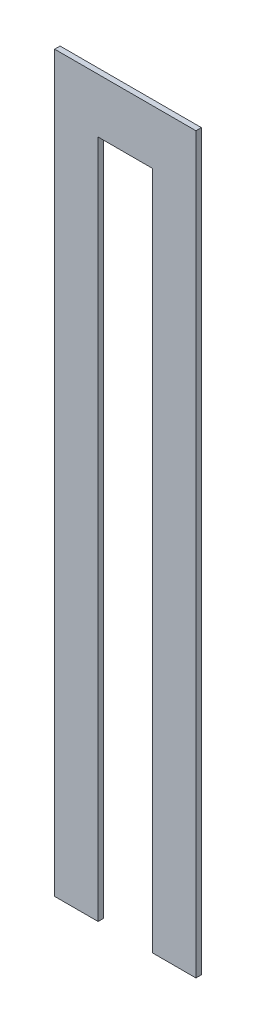
ISO-10303-21;
HEADER;
FILE_DESCRIPTION(('STEP AP214'),'2;1');
FILE_NAME('part.step','',(''),(''),'','','');
FILE_SCHEMA(('AUTOMOTIVE_DESIGN { 1 0 10303 214 1 1 1 1 }'));
ENDSEC;
DATA;
#1=APPLICATION_CONTEXT('core data for automotive mechanical design processes');
#2=APPLICATION_PROTOCOL_DEFINITION('international standard','automotive_design',2000,#1);
#3=PRODUCT_CONTEXT('',#1,'mechanical');
#4=PRODUCT('Part','Part','',(#3));
#5=PRODUCT_RELATED_PRODUCT_CATEGORY('part','',(#4));
#6=PRODUCT_DEFINITION_FORMATION('','',#4);
#7=PRODUCT_DEFINITION_CONTEXT('part definition',#1,'design');
#8=PRODUCT_DEFINITION('design','',#6,#7);
#9=PRODUCT_DEFINITION_SHAPE('','',#8);
#10=(LENGTH_UNIT() NAMED_UNIT(*) SI_UNIT(.MILLI.,.METRE.));
#11=(NAMED_UNIT(*) PLANE_ANGLE_UNIT() SI_UNIT($,.RADIAN.));
#12=(NAMED_UNIT(*) SI_UNIT($,.STERADIAN.) SOLID_ANGLE_UNIT());
#13=UNCERTAINTY_MEASURE_WITH_UNIT(LENGTH_MEASURE(1.E-05),#10,'distance_accuracy_value','');
#14=(GEOMETRIC_REPRESENTATION_CONTEXT(3) GLOBAL_UNCERTAINTY_ASSIGNED_CONTEXT((#13)) GLOBAL_UNIT_ASSIGNED_CONTEXT((#10,
#11,#12)) REPRESENTATION_CONTEXT('',''));
#15=CARTESIAN_POINT('',(0.,0.,0.));
#16=DIRECTION('',(0.,0.,1.));
#17=DIRECTION('',(1.,0.,0.));
#18=AXIS2_PLACEMENT_3D('',#15,#16,#17);
#19=CARTESIAN_POINT('',(-6.50000000000001,67.5,0.5));
#20=DIRECTION('',(1.,0.,0.));
#21=DIRECTION('',(0.,1.,0.));
#22=AXIS2_PLACEMENT_3D('',#19,#20,#21);
#23=PLANE('',#22);
#24=DIRECTION('',(0.,-1.,0.));
#25=VECTOR('',#24,1.);
#26=CARTESIAN_POINT('',(-6.50000000000001,67.5,0.));
#27=LINE('',#26,#25);
#28=CARTESIAN_POINT('',(-6.50000000000001,67.5,0.));
#29=VERTEX_POINT('',#28);
#30=CARTESIAN_POINT('',(-6.5,0.,0.));
#31=VERTEX_POINT('',#30);
#32=EDGE_CURVE('E131',#29,#31,#27,.T.);
#33=ORIENTED_EDGE('',*,*,#32,.T.);
#34=DIRECTION('',(0.,0.,-1.));
#35=VECTOR('',#34,1.);
#36=CARTESIAN_POINT('',(-6.5,0.,0.5));
#37=LINE('',#36,#35);
#38=CARTESIAN_POINT('',(-6.5,0.,0.5));
#39=VERTEX_POINT('',#38);
#40=EDGE_CURVE('E11',#39,#31,#37,.T.);
#41=ORIENTED_EDGE('',*,*,#40,.F.);
#42=DIRECTION('',(0.,-1.,0.));
#43=VECTOR('',#42,1.);
#44=CARTESIAN_POINT('',(-6.50000000000001,67.5,0.5));
#45=LINE('',#44,#43);
#46=CARTESIAN_POINT('',(-6.50000000000001,67.5,0.5));
#47=VERTEX_POINT('',#46);
#48=EDGE_CURVE('E145',#47,#39,#45,.T.);
#49=ORIENTED_EDGE('',*,*,#48,.F.);
#50=DIRECTION('',(0.,0.,-1.));
#51=VECTOR('',#50,1.);
#52=CARTESIAN_POINT('',(-6.50000000000001,67.5,0.5));
#53=LINE('',#52,#51);
#54=EDGE_CURVE('E127',#47,#29,#53,.T.);
#55=ORIENTED_EDGE('',*,*,#54,.T.);
#56=EDGE_LOOP('',(#33,#41,#49,#55));
#57=FACE_BOUND('',#56,.T.);
#58=ADVANCED_FACE('F35',(#57),#23,.F.);
#59=CARTESIAN_POINT('',(-6.5,0.,0.5));
#60=DIRECTION('',(0.,1.,0.));
#61=DIRECTION('',(0.,0.,1.));
#62=AXIS2_PLACEMENT_3D('',#59,#60,#61);
#63=PLANE('',#62);
#64=DIRECTION('',(1.,0.,0.));
#65=VECTOR('',#64,1.);
#66=CARTESIAN_POINT('',(-6.5,0.,0.));
#67=LINE('',#66,#65);
#68=CARTESIAN_POINT('',(-2.5,0.,0.));
#69=VERTEX_POINT('',#68);
#70=EDGE_CURVE('E134',#31,#69,#67,.T.);
#71=ORIENTED_EDGE('',*,*,#70,.T.);
#72=DIRECTION('',(0.,0.,-1.));
#73=VECTOR('',#72,1.);
#74=CARTESIAN_POINT('',(-2.5,0.,0.5));
#75=LINE('',#74,#73);
#76=CARTESIAN_POINT('',(-2.5,0.,0.5));
#77=VERTEX_POINT('',#76);
#78=EDGE_CURVE('E43',#77,#69,#75,.T.);
#79=ORIENTED_EDGE('',*,*,#78,.F.);
#80=DIRECTION('',(1.,0.,0.));
#81=VECTOR('',#80,1.);
#82=CARTESIAN_POINT('',(-6.5,0.,0.5));
#83=LINE('',#82,#81);
#84=EDGE_CURVE('E94',#39,#77,#83,.T.);
#85=ORIENTED_EDGE('',*,*,#84,.F.);
#86=ORIENTED_EDGE('',*,*,#40,.T.);
#87=EDGE_LOOP('',(#71,#79,#85,#86));
#88=FACE_BOUND('',#87,.T.);
#89=ADVANCED_FACE('F180',(#88),#63,.F.);
#90=CARTESIAN_POINT('',(-2.5,0.,0.5));
#91=DIRECTION('',(-1.,0.,0.));
#92=DIRECTION('',(0.,0.,1.));
#93=AXIS2_PLACEMENT_3D('',#90,#91,#92);
#94=PLANE('',#93);
#95=DIRECTION('',(0.,1.,0.));
#96=VECTOR('',#95,1.);
#97=CARTESIAN_POINT('',(-2.5,0.,0.));
#98=LINE('',#97,#96);
#99=CARTESIAN_POINT('',(-2.5,62.5,0.));
#100=VERTEX_POINT('',#99);
#101=EDGE_CURVE('E136',#69,#100,#98,.T.);
#102=ORIENTED_EDGE('',*,*,#101,.T.);
#103=DIRECTION('',(0.,0.,-1.));
#104=VECTOR('',#103,1.);
#105=CARTESIAN_POINT('',(-2.5,62.5,0.5));
#106=LINE('',#105,#104);
#107=CARTESIAN_POINT('',(-2.5,62.5,0.5));
#108=VERTEX_POINT('',#107);
#109=EDGE_CURVE('E152',#108,#100,#106,.T.);
#110=ORIENTED_EDGE('',*,*,#109,.F.);
#111=DIRECTION('',(0.,1.,0.));
#112=VECTOR('',#111,1.);
#113=CARTESIAN_POINT('',(-2.5,0.,0.5));
#114=LINE('',#113,#112);
#115=EDGE_CURVE('E160',#77,#108,#114,.T.);
#116=ORIENTED_EDGE('',*,*,#115,.F.);
#117=ORIENTED_EDGE('',*,*,#78,.T.);
#118=EDGE_LOOP('',(#102,#110,#116,#117));
#119=FACE_BOUND('',#118,.T.);
#120=ADVANCED_FACE('F158',(#119),#94,.F.);
#121=CARTESIAN_POINT('',(-2.5,62.5,0.5));
#122=DIRECTION('',(0.,1.,0.));
#123=DIRECTION('',(0.,0.,1.));
#124=AXIS2_PLACEMENT_3D('',#121,#122,#123);
#125=PLANE('',#124);
#126=DIRECTION('',(1.,0.,0.));
#127=VECTOR('',#126,1.);
#128=CARTESIAN_POINT('',(-2.5,62.5,0.));
#129=LINE('',#128,#127);
#130=CARTESIAN_POINT('',(2.5,62.5,0.));
#131=VERTEX_POINT('',#130);
#132=EDGE_CURVE('E138',#100,#131,#129,.T.);
#133=ORIENTED_EDGE('',*,*,#132,.T.);
#134=DIRECTION('',(0.,0.,-1.));
#135=VECTOR('',#134,1.);
#136=CARTESIAN_POINT('',(2.5,62.5,0.5));
#137=LINE('',#136,#135);
#138=CARTESIAN_POINT('',(2.5,62.5,0.5));
#139=VERTEX_POINT('',#138);
#140=EDGE_CURVE('E149',#139,#131,#137,.T.);
#141=ORIENTED_EDGE('',*,*,#140,.F.);
#142=DIRECTION('',(1.,0.,0.));
#143=VECTOR('',#142,1.);
#144=CARTESIAN_POINT('',(-2.5,62.5,0.5));
#145=LINE('',#144,#143);
#146=EDGE_CURVE('E172',#108,#139,#145,.T.);
#147=ORIENTED_EDGE('',*,*,#146,.F.);
#148=ORIENTED_EDGE('',*,*,#109,.T.);
#149=EDGE_LOOP('',(#133,#141,#147,#148));
#150=FACE_BOUND('',#149,.T.);
#151=ADVANCED_FACE('F168',(#150),#125,.F.);
#152=CARTESIAN_POINT('',(2.5,62.5,0.5));
#153=DIRECTION('',(1.,0.,0.));
#154=DIRECTION('',(0.,1.,0.));
#155=AXIS2_PLACEMENT_3D('',#152,#153,#154);
#156=PLANE('',#155);
#157=DIRECTION('',(0.,-1.,0.));
#158=VECTOR('',#157,1.);
#159=CARTESIAN_POINT('',(2.5,62.5,0.));
#160=LINE('',#159,#158);
#161=CARTESIAN_POINT('',(2.50000000000001,0.,0.));
#162=VERTEX_POINT('',#161);
#163=EDGE_CURVE('E140',#131,#162,#160,.T.);
#164=ORIENTED_EDGE('',*,*,#163,.T.);
#165=DIRECTION('',(0.,0.,-1.));
#166=VECTOR('',#165,1.);
#167=CARTESIAN_POINT('',(2.50000000000001,0.,0.5));
#168=LINE('',#167,#166);
#169=CARTESIAN_POINT('',(2.50000000000001,0.,0.5));
#170=VERTEX_POINT('',#169);
#171=EDGE_CURVE('E122',#170,#162,#168,.T.);
#172=ORIENTED_EDGE('',*,*,#171,.F.);
#173=DIRECTION('',(0.,-1.,0.));
#174=VECTOR('',#173,1.);
#175=CARTESIAN_POINT('',(2.5,62.5,0.5));
#176=LINE('',#175,#174);
#177=EDGE_CURVE('E113',#139,#170,#176,.T.);
#178=ORIENTED_EDGE('',*,*,#177,.F.);
#179=ORIENTED_EDGE('',*,*,#140,.T.);
#180=EDGE_LOOP('',(#164,#172,#178,#179));
#181=FACE_BOUND('',#180,.T.);
#182=ADVANCED_FACE('F171',(#181),#156,.F.);
#183=CARTESIAN_POINT('',(2.50000000000001,0.,0.5));
#184=DIRECTION('',(0.,1.,0.));
#185=DIRECTION('',(-1.,0.,0.));
#186=AXIS2_PLACEMENT_3D('',#183,#184,#185);
#187=PLANE('',#186);
#188=DIRECTION('',(1.,0.,0.));
#189=VECTOR('',#188,1.);
#190=CARTESIAN_POINT('',(2.50000000000001,0.,0.));
#191=LINE('',#190,#189);
#192=CARTESIAN_POINT('',(6.5,0.,0.));
#193=VERTEX_POINT('',#192);
#194=EDGE_CURVE('E121',#162,#193,#191,.T.);
#195=ORIENTED_EDGE('',*,*,#194,.T.);
#196=DIRECTION('',(0.,0.,-1.));
#197=VECTOR('',#196,1.);
#198=CARTESIAN_POINT('',(6.5,0.,0.5));
#199=LINE('',#198,#197);
#200=CARTESIAN_POINT('',(6.5,0.,0.5));
#201=VERTEX_POINT('',#200);
#202=EDGE_CURVE('E118',#201,#193,#199,.T.);
#203=ORIENTED_EDGE('',*,*,#202,.F.);
#204=DIRECTION('',(1.,0.,0.));
#205=VECTOR('',#204,1.);
#206=CARTESIAN_POINT('',(2.50000000000001,0.,0.5));
#207=LINE('',#206,#205);
#208=EDGE_CURVE('E107',#170,#201,#207,.T.);
#209=ORIENTED_EDGE('',*,*,#208,.F.);
#210=ORIENTED_EDGE('',*,*,#171,.T.);
#211=EDGE_LOOP('',(#195,#203,#209,#210));
#212=FACE_BOUND('',#211,.T.);
#213=ADVANCED_FACE('F119',(#212),#187,.F.);
#214=CARTESIAN_POINT('',(6.49999999999999,67.5,0.5));
#215=DIRECTION('',(-1.,0.,0.));
#216=DIRECTION('',(0.,-1.,0.));
#217=AXIS2_PLACEMENT_3D('',#214,#215,#216);
#218=PLANE('',#217);
#219=DIRECTION('',(0.,1.,0.));
#220=VECTOR('',#219,1.);
#221=CARTESIAN_POINT('',(6.49999999999999,67.5,0.));
#222=LINE('',#221,#220);
#223=CARTESIAN_POINT('',(6.49999999999999,67.5,0.));
#224=VERTEX_POINT('',#223);
#225=EDGE_CURVE('E80',#193,#224,#222,.T.);
#226=ORIENTED_EDGE('',*,*,#225,.T.);
#227=DIRECTION('',(0.,0.,-1.));
#228=VECTOR('',#227,1.);
#229=CARTESIAN_POINT('',(6.49999999999999,67.5,0.5));
#230=LINE('',#229,#228);
#231=CARTESIAN_POINT('',(6.49999999999999,67.5,0.5));
#232=VERTEX_POINT('',#231);
#233=EDGE_CURVE('E123',#232,#224,#230,.T.);
#234=ORIENTED_EDGE('',*,*,#233,.F.);
#235=DIRECTION('',(0.,1.,0.));
#236=VECTOR('',#235,1.);
#237=CARTESIAN_POINT('',(6.49999999999999,67.5,0.5));
#238=LINE('',#237,#236);
#239=EDGE_CURVE('E111',#201,#232,#238,.T.);
#240=ORIENTED_EDGE('',*,*,#239,.F.);
#241=ORIENTED_EDGE('',*,*,#202,.T.);
#242=EDGE_LOOP('',(#226,#234,#240,#241));
#243=FACE_BOUND('',#242,.T.);
#244=ADVANCED_FACE('F125',(#243),#218,.F.);
#245=CARTESIAN_POINT('',(-6.50000000000001,67.5,0.5));
#246=DIRECTION('',(0.,-1.,0.));
#247=DIRECTION('',(0.,0.,-1.));
#248=AXIS2_PLACEMENT_3D('',#245,#246,#247);
#249=PLANE('',#248);
#250=DIRECTION('',(-1.,0.,0.));
#251=VECTOR('',#250,1.);
#252=CARTESIAN_POINT('',(-6.50000000000001,67.5,0.));
#253=LINE('',#252,#251);
#254=EDGE_CURVE('E86',#224,#29,#253,.T.);
#255=ORIENTED_EDGE('',*,*,#254,.T.);
#256=ORIENTED_EDGE('',*,*,#54,.F.);
#257=DIRECTION('',(-1.,0.,0.));
#258=VECTOR('',#257,1.);
#259=CARTESIAN_POINT('',(-6.50000000000001,67.5,0.5));
#260=LINE('',#259,#258);
#261=EDGE_CURVE('E51',#232,#47,#260,.T.);
#262=ORIENTED_EDGE('',*,*,#261,.F.);
#263=ORIENTED_EDGE('',*,*,#233,.T.);
#264=EDGE_LOOP('',(#255,#256,#262,#263));
#265=FACE_BOUND('',#264,.T.);
#266=ADVANCED_FACE('F196',(#265),#249,.F.);
#267=CARTESIAN_POINT('',(0.,0.,0.5));
#268=DIRECTION('',(0.,0.,1.));
#269=DIRECTION('',(1.,0.,0.));
#270=AXIS2_PLACEMENT_3D('',#267,#268,#269);
#271=PLANE('',#270);
#272=ORIENTED_EDGE('',*,*,#48,.T.);
#273=ORIENTED_EDGE('',*,*,#84,.T.);
#274=ORIENTED_EDGE('',*,*,#115,.T.);
#275=ORIENTED_EDGE('',*,*,#146,.T.);
#276=ORIENTED_EDGE('',*,*,#177,.T.);
#277=ORIENTED_EDGE('',*,*,#208,.T.);
#278=ORIENTED_EDGE('',*,*,#239,.T.);
#279=ORIENTED_EDGE('',*,*,#261,.T.);
#280=EDGE_LOOP('',(#272,#273,#274,#275,#276,#277,#278,#279));
#281=FACE_BOUND('',#280,.T.);
#282=ADVANCED_FACE('F109',(#281),#271,.T.);
#283=CARTESIAN_POINT('',(0.,0.,0.));
#284=DIRECTION('',(0.,0.,1.));
#285=DIRECTION('',(1.,0.,0.));
#286=AXIS2_PLACEMENT_3D('',#283,#284,#285);
#287=PLANE('',#286);
#288=ORIENTED_EDGE('',*,*,#32,.F.);
#289=ORIENTED_EDGE('',*,*,#254,.F.);
#290=ORIENTED_EDGE('',*,*,#225,.F.);
#291=ORIENTED_EDGE('',*,*,#194,.F.);
#292=ORIENTED_EDGE('',*,*,#163,.F.);
#293=ORIENTED_EDGE('',*,*,#132,.F.);
#294=ORIENTED_EDGE('',*,*,#101,.F.);
#295=ORIENTED_EDGE('',*,*,#70,.F.);
#296=EDGE_LOOP('',(#288,#289,#290,#291,#292,#293,#294,#295));
#297=FACE_BOUND('',#296,.T.);
#298=ADVANCED_FACE('F164',(#297),#287,.F.);
#299=CLOSED_SHELL('',(#58,#89,#120,#151,#182,#213,#244,#266,#282,#298));
#300=MANIFOLD_SOLID_BREP('B2',#299);
#301=ADVANCED_BREP_SHAPE_REPRESENTATION('',(#18,#300),#14);
#302=SHAPE_DEFINITION_REPRESENTATION(#9,#301);
ENDSEC;
END-ISO-10303-21;
